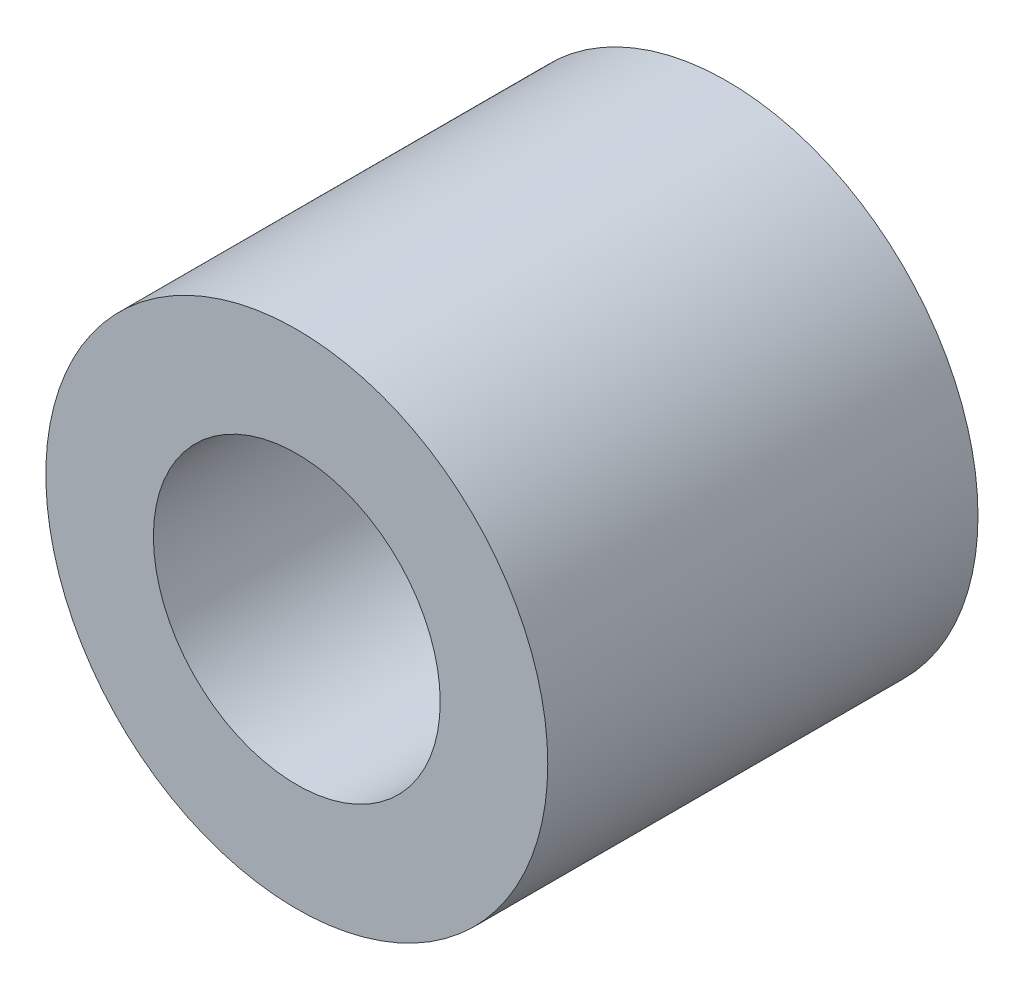
ISO-10303-21;
HEADER;
FILE_DESCRIPTION(('STEP AP214'),'2;1');
FILE_NAME('part.step','',(''),(''),'','','');
FILE_SCHEMA(('AUTOMOTIVE_DESIGN { 1 0 10303 214 1 1 1 1 }'));
ENDSEC;
DATA;
#1=APPLICATION_CONTEXT('core data for automotive mechanical design processes');
#2=APPLICATION_PROTOCOL_DEFINITION('international standard','automotive_design',2000,#1);
#3=PRODUCT_CONTEXT('',#1,'mechanical');
#4=PRODUCT('Part','Part','',(#3));
#5=PRODUCT_RELATED_PRODUCT_CATEGORY('part','',(#4));
#6=PRODUCT_DEFINITION_FORMATION('','',#4);
#7=PRODUCT_DEFINITION_CONTEXT('part definition',#1,'design');
#8=PRODUCT_DEFINITION('design','',#6,#7);
#9=PRODUCT_DEFINITION_SHAPE('','',#8);
#10=(LENGTH_UNIT() NAMED_UNIT(*) SI_UNIT(.MILLI.,.METRE.));
#11=(NAMED_UNIT(*) PLANE_ANGLE_UNIT() SI_UNIT($,.RADIAN.));
#12=(NAMED_UNIT(*) SI_UNIT($,.STERADIAN.) SOLID_ANGLE_UNIT());
#13=UNCERTAINTY_MEASURE_WITH_UNIT(LENGTH_MEASURE(1.E-05),#10,'distance_accuracy_value','');
#14=(GEOMETRIC_REPRESENTATION_CONTEXT(3) GLOBAL_UNCERTAINTY_ASSIGNED_CONTEXT((#13)) GLOBAL_UNIT_ASSIGNED_CONTEXT((#10,
#11,#12)) REPRESENTATION_CONTEXT('',''));
#15=CARTESIAN_POINT('',(0.,0.,0.));
#16=DIRECTION('',(0.,0.,1.));
#17=DIRECTION('',(1.,0.,0.));
#18=AXIS2_PLACEMENT_3D('',#15,#16,#17);
#19=CARTESIAN_POINT('',(0.,0.,3.));
#20=DIRECTION('',(0.,0.,1.));
#21=DIRECTION('',(1.,0.,0.));
#22=AXIS2_PLACEMENT_3D('',#19,#20,#21);
#23=PLANE('',#22);
#24=CARTESIAN_POINT('',(0.,0.,3.));
#25=DIRECTION('',(0.,0.,1.));
#26=DIRECTION('',(1.,0.,0.));
#27=AXIS2_PLACEMENT_3D('',#24,#25,#26);
#28=CIRCLE('',#27,1.75);
#29=CARTESIAN_POINT('',(1.75,0.,3.));
#30=VERTEX_POINT('',#29);
#31=EDGE_CURVE('E10',#30,#30,#28,.T.);
#32=ORIENTED_EDGE('',*,*,#31,.T.);
#33=EDGE_LOOP('',(#32));
#34=FACE_BOUND('',#33,.T.);
#35=CARTESIAN_POINT('',(0.,0.,3.));
#36=DIRECTION('',(0.,0.,1.));
#37=DIRECTION('',(1.,0.,0.));
#38=AXIS2_PLACEMENT_3D('',#35,#36,#37);
#39=CIRCLE('',#38,1.);
#40=CARTESIAN_POINT('',(1.,0.,3.));
#41=VERTEX_POINT('',#40);
#42=EDGE_CURVE('E42',#41,#41,#39,.T.);
#43=ORIENTED_EDGE('',*,*,#42,.F.);
#44=EDGE_LOOP('',(#43));
#45=FACE_BOUND('',#44,.T.);
#46=ADVANCED_FACE('F31',(#34,#45),#23,.T.);
#47=CARTESIAN_POINT('',(0.,0.,0.));
#48=DIRECTION('',(0.,0.,1.));
#49=DIRECTION('',(1.,0.,0.));
#50=AXIS2_PLACEMENT_3D('',#47,#48,#49);
#51=PLANE('',#50);
#52=CARTESIAN_POINT('',(0.,0.,0.));
#53=DIRECTION('',(0.,0.,1.));
#54=DIRECTION('',(1.,0.,0.));
#55=AXIS2_PLACEMENT_3D('',#52,#53,#54);
#56=CIRCLE('',#55,1.75);
#57=CARTESIAN_POINT('',(1.75,0.,0.));
#58=VERTEX_POINT('',#57);
#59=EDGE_CURVE('E35',#58,#58,#56,.T.);
#60=ORIENTED_EDGE('',*,*,#59,.F.);
#61=EDGE_LOOP('',(#60));
#62=FACE_BOUND('',#61,.T.);
#63=CARTESIAN_POINT('',(0.,0.,0.));
#64=DIRECTION('',(0.,0.,1.));
#65=DIRECTION('',(1.,0.,0.));
#66=AXIS2_PLACEMENT_3D('',#63,#64,#65);
#67=CIRCLE('',#66,1.);
#68=CARTESIAN_POINT('',(1.,0.,0.));
#69=VERTEX_POINT('',#68);
#70=EDGE_CURVE('E44',#69,#69,#67,.T.);
#71=ORIENTED_EDGE('',*,*,#70,.T.);
#72=EDGE_LOOP('',(#71));
#73=FACE_BOUND('',#72,.T.);
#74=ADVANCED_FACE('F54',(#62,#73),#51,.F.);
#75=CARTESIAN_POINT('',(0.,0.,3.));
#76=DIRECTION('',(0.,0.,-1.));
#77=DIRECTION('',(-1.,0.,0.));
#78=AXIS2_PLACEMENT_3D('',#75,#76,#77);
#79=CYLINDRICAL_SURFACE('',#78,1.75);
#80=ORIENTED_EDGE('',*,*,#31,.F.);
#81=EDGE_LOOP('',(#80));
#82=FACE_BOUND('',#81,.T.);
#83=ORIENTED_EDGE('',*,*,#59,.T.);
#84=EDGE_LOOP('',(#83));
#85=FACE_BOUND('',#84,.T.);
#86=ADVANCED_FACE('F33',(#82,#85),#79,.T.);
#87=CARTESIAN_POINT('',(0.,0.,3.));
#88=DIRECTION('',(0.,0.,-1.));
#89=DIRECTION('',(-1.,0.,0.));
#90=AXIS2_PLACEMENT_3D('',#87,#88,#89);
#91=CYLINDRICAL_SURFACE('',#90,1.);
#92=ORIENTED_EDGE('',*,*,#42,.T.);
#93=EDGE_LOOP('',(#92));
#94=FACE_BOUND('',#93,.T.);
#95=ORIENTED_EDGE('',*,*,#70,.F.);
#96=EDGE_LOOP('',(#95));
#97=FACE_BOUND('',#96,.T.);
#98=ADVANCED_FACE('F50',(#94,#97),#91,.F.);
#99=CLOSED_SHELL('',(#46,#74,#86,#98));
#100=MANIFOLD_SOLID_BREP('B2',#99);
#101=ADVANCED_BREP_SHAPE_REPRESENTATION('',(#18,#100),#14);
#102=SHAPE_DEFINITION_REPRESENTATION(#9,#101);
ENDSEC;
END-ISO-10303-21;
